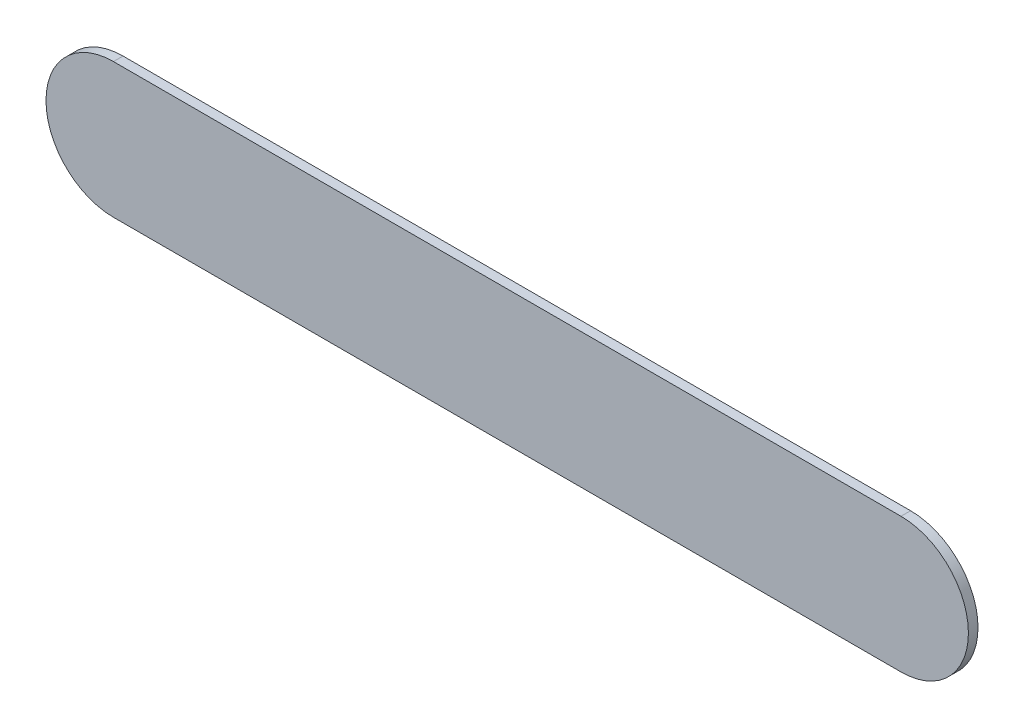
ISO-10303-21;
HEADER;
FILE_DESCRIPTION(('STEP AP214'),'2;1');
FILE_NAME('part.step','',(''),(''),'','','');
FILE_SCHEMA(('AUTOMOTIVE_DESIGN { 1 0 10303 214 1 1 1 1 }'));
ENDSEC;
DATA;
#1=APPLICATION_CONTEXT('core data for automotive mechanical design processes');
#2=APPLICATION_PROTOCOL_DEFINITION('international standard','automotive_design',2000,#1);
#3=PRODUCT_CONTEXT('',#1,'mechanical');
#4=PRODUCT('Part','Part','',(#3));
#5=PRODUCT_RELATED_PRODUCT_CATEGORY('part','',(#4));
#6=PRODUCT_DEFINITION_FORMATION('','',#4);
#7=PRODUCT_DEFINITION_CONTEXT('part definition',#1,'design');
#8=PRODUCT_DEFINITION('design','',#6,#7);
#9=PRODUCT_DEFINITION_SHAPE('','',#8);
#10=(LENGTH_UNIT() NAMED_UNIT(*) SI_UNIT(.MILLI.,.METRE.));
#11=(NAMED_UNIT(*) PLANE_ANGLE_UNIT() SI_UNIT($,.RADIAN.));
#12=(NAMED_UNIT(*) SI_UNIT($,.STERADIAN.) SOLID_ANGLE_UNIT());
#13=UNCERTAINTY_MEASURE_WITH_UNIT(LENGTH_MEASURE(1.E-05),#10,'distance_accuracy_value','');
#14=(GEOMETRIC_REPRESENTATION_CONTEXT(3) GLOBAL_UNCERTAINTY_ASSIGNED_CONTEXT((#13)) GLOBAL_UNIT_ASSIGNED_CONTEXT((#10,
#11,#12)) REPRESENTATION_CONTEXT('',''));
#15=CARTESIAN_POINT('',(0.,0.,0.));
#16=DIRECTION('',(0.,0.,1.));
#17=DIRECTION('',(1.,0.,0.));
#18=AXIS2_PLACEMENT_3D('',#15,#16,#17);
#19=CARTESIAN_POINT('',(110.90000172,65.75000058,0.));
#20=DIRECTION('',(0.,1.,0.));
#21=DIRECTION('',(1.,0.,0.));
#22=AXIS2_PLACEMENT_3D('',#19,#20,#21);
#23=PLANE('',#22);
#24=DIRECTION('',(1.,0.,0.));
#25=VECTOR('',#24,1.);
#26=CARTESIAN_POINT('',(110.90000172,65.75000058,0.03556));
#27=LINE('',#26,#25);
#28=CARTESIAN_POINT('',(110.90000172,65.75000058,0.03556));
#29=VERTEX_POINT('',#28);
#30=CARTESIAN_POINT('',(113.82001112,65.75000058,0.03556));
#31=VERTEX_POINT('',#30);
#32=EDGE_CURVE('E11',#29,#31,#27,.T.);
#33=ORIENTED_EDGE('',*,*,#32,.F.);
#34=DIRECTION('',(0.,0.,1.));
#35=VECTOR('',#34,1.);
#36=CARTESIAN_POINT('',(110.90000172,65.75000058,0.));
#37=LINE('',#36,#35);
#38=CARTESIAN_POINT('',(110.90000172,65.75000058,0.));
#39=VERTEX_POINT('',#38);
#40=EDGE_CURVE('E24',#39,#29,#37,.T.);
#41=ORIENTED_EDGE('',*,*,#40,.F.);
#42=DIRECTION('',(1.,0.,0.));
#43=VECTOR('',#42,1.);
#44=CARTESIAN_POINT('',(110.90000172,65.75000058,0.));
#45=LINE('',#44,#43);
#46=CARTESIAN_POINT('',(113.82001112,65.75000058,0.));
#47=VERTEX_POINT('',#46);
#48=EDGE_CURVE('E75',#39,#47,#45,.T.);
#49=ORIENTED_EDGE('',*,*,#48,.T.);
#50=DIRECTION('',(0.,0.,1.));
#51=VECTOR('',#50,1.);
#52=CARTESIAN_POINT('',(113.82001112,65.75000058,0.));
#53=LINE('',#52,#51);
#54=EDGE_CURVE('E37',#47,#31,#53,.T.);
#55=ORIENTED_EDGE('',*,*,#54,.T.);
#56=EDGE_LOOP('',(#33,#41,#49,#55));
#57=FACE_BOUND('',#56,.T.);
#58=ADVANCED_FACE('F17',(#57),#23,.F.);
#59=CARTESIAN_POINT('',(113.82001112,66.00000008,0.));
#60=DIRECTION('',(0.,0.,-1.));
#61=DIRECTION('',(0.,-1.,0.));
#62=AXIS2_PLACEMENT_3D('',#59,#60,#61);
#63=CYLINDRICAL_SURFACE('',#62,0.249999500000001);
#64=CARTESIAN_POINT('',(113.82001112,66.00000008,0.03556));
#65=DIRECTION('',(0.,0.,1.));
#66=DIRECTION('',(0.,-1.,0.));
#67=AXIS2_PLACEMENT_3D('',#64,#65,#66);
#68=CIRCLE('',#67,0.249999500000001);
#69=CARTESIAN_POINT('',(113.82001112,66.24999958,0.03556));
#70=VERTEX_POINT('',#69);
#71=EDGE_CURVE('E83',#31,#70,#68,.T.);
#72=ORIENTED_EDGE('',*,*,#71,.F.);
#73=ORIENTED_EDGE('',*,*,#54,.F.);
#74=CARTESIAN_POINT('',(113.82001112,66.00000008,0.));
#75=DIRECTION('',(0.,0.,1.));
#76=DIRECTION('',(0.,-1.,0.));
#77=AXIS2_PLACEMENT_3D('',#74,#75,#76);
#78=CIRCLE('',#77,0.249999500000001);
#79=CARTESIAN_POINT('',(113.82001112,66.24999958,0.));
#80=VERTEX_POINT('',#79);
#81=EDGE_CURVE('E81',#47,#80,#78,.T.);
#82=ORIENTED_EDGE('',*,*,#81,.T.);
#83=DIRECTION('',(0.,0.,1.));
#84=VECTOR('',#83,1.);
#85=CARTESIAN_POINT('',(113.82001112,66.24999958,0.));
#86=LINE('',#85,#84);
#87=EDGE_CURVE('E67',#80,#70,#86,.T.);
#88=ORIENTED_EDGE('',*,*,#87,.T.);
#89=EDGE_LOOP('',(#72,#73,#82,#88));
#90=FACE_BOUND('',#89,.T.);
#91=ADVANCED_FACE('F89',(#90),#63,.T.);
#92=CARTESIAN_POINT('',(113.82001112,66.24999958,0.));
#93=DIRECTION('',(0.,-1.,0.));
#94=DIRECTION('',(-1.,0.,0.));
#95=AXIS2_PLACEMENT_3D('',#92,#93,#94);
#96=PLANE('',#95);
#97=DIRECTION('',(-1.,0.,0.));
#98=VECTOR('',#97,1.);
#99=CARTESIAN_POINT('',(113.82001112,66.24999958,0.03556));
#100=LINE('',#99,#98);
#101=CARTESIAN_POINT('',(110.90000172,66.24999958,0.03556));
#102=VERTEX_POINT('',#101);
#103=EDGE_CURVE('E71',#70,#102,#100,.T.);
#104=ORIENTED_EDGE('',*,*,#103,.F.);
#105=ORIENTED_EDGE('',*,*,#87,.F.);
#106=DIRECTION('',(-1.,0.,0.));
#107=VECTOR('',#106,1.);
#108=CARTESIAN_POINT('',(113.82001112,66.24999958,0.));
#109=LINE('',#108,#107);
#110=CARTESIAN_POINT('',(110.90000172,66.24999958,0.));
#111=VERTEX_POINT('',#110);
#112=EDGE_CURVE('E63',#80,#111,#109,.T.);
#113=ORIENTED_EDGE('',*,*,#112,.T.);
#114=DIRECTION('',(0.,0.,1.));
#115=VECTOR('',#114,1.);
#116=CARTESIAN_POINT('',(110.90000172,66.24999958,0.));
#117=LINE('',#116,#115);
#118=EDGE_CURVE('E53',#111,#102,#117,.T.);
#119=ORIENTED_EDGE('',*,*,#118,.T.);
#120=EDGE_LOOP('',(#104,#105,#113,#119));
#121=FACE_BOUND('',#120,.T.);
#122=ADVANCED_FACE('F66',(#121),#96,.F.);
#123=CARTESIAN_POINT('',(110.90000172,66.00000008,0.));
#124=DIRECTION('',(0.,0.,-1.));
#125=DIRECTION('',(-1.13687065095746E-13,1.,0.));
#126=AXIS2_PLACEMENT_3D('',#123,#124,#125);
#127=CYLINDRICAL_SURFACE('',#126,0.249999500000006);
#128=CARTESIAN_POINT('',(110.90000172,66.00000008,0.03556));
#129=DIRECTION('',(0.,0.,1.));
#130=DIRECTION('',(-1.13687065095746E-13,1.,0.));
#131=AXIS2_PLACEMENT_3D('',#128,#129,#130);
#132=CIRCLE('',#131,0.249999500000006);
#133=EDGE_CURVE('E59',#102,#29,#132,.T.);
#134=ORIENTED_EDGE('',*,*,#133,.F.);
#135=ORIENTED_EDGE('',*,*,#118,.F.);
#136=CARTESIAN_POINT('',(110.90000172,66.00000008,0.));
#137=DIRECTION('',(0.,0.,1.));
#138=DIRECTION('',(-1.13687065095746E-13,1.,0.));
#139=AXIS2_PLACEMENT_3D('',#136,#137,#138);
#140=CIRCLE('',#139,0.249999500000006);
#141=EDGE_CURVE('E57',#111,#39,#140,.T.);
#142=ORIENTED_EDGE('',*,*,#141,.T.);
#143=ORIENTED_EDGE('',*,*,#40,.T.);
#144=EDGE_LOOP('',(#134,#135,#142,#143));
#145=FACE_BOUND('',#144,.T.);
#146=ADVANCED_FACE('F55',(#145),#127,.T.);
#147=CARTESIAN_POINT('',(110.90000172,65.75000058,0.));
#148=DIRECTION('',(0.,0.,-1.));
#149=DIRECTION('',(-1.,0.,0.));
#150=AXIS2_PLACEMENT_3D('',#147,#148,#149);
#151=PLANE('',#150);
#152=ORIENTED_EDGE('',*,*,#141,.F.);
#153=ORIENTED_EDGE('',*,*,#112,.F.);
#154=ORIENTED_EDGE('',*,*,#81,.F.);
#155=ORIENTED_EDGE('',*,*,#48,.F.);
#156=EDGE_LOOP('',(#152,#153,#154,#155));
#157=FACE_BOUND('',#156,.T.);
#158=ADVANCED_FACE('F74',(#157),#151,.T.);
#159=CARTESIAN_POINT('',(110.90000172,65.75000058,0.03556));
#160=DIRECTION('',(0.,0.,-1.));
#161=DIRECTION('',(-1.,0.,0.));
#162=AXIS2_PLACEMENT_3D('',#159,#160,#161);
#163=PLANE('',#162);
#164=ORIENTED_EDGE('',*,*,#32,.T.);
#165=ORIENTED_EDGE('',*,*,#71,.T.);
#166=ORIENTED_EDGE('',*,*,#103,.T.);
#167=ORIENTED_EDGE('',*,*,#133,.T.);
#168=EDGE_LOOP('',(#164,#165,#166,#167));
#169=FACE_BOUND('',#168,.T.);
#170=ADVANCED_FACE('F91',(#169),#163,.F.);
#171=CLOSED_SHELL('',(#58,#91,#122,#146,#158,#170));
#172=MANIFOLD_SOLID_BREP('B1',#171);
#173=ADVANCED_BREP_SHAPE_REPRESENTATION('',(#18,#172),#14);
#174=SHAPE_DEFINITION_REPRESENTATION(#9,#173);
ENDSEC;
END-ISO-10303-21;
